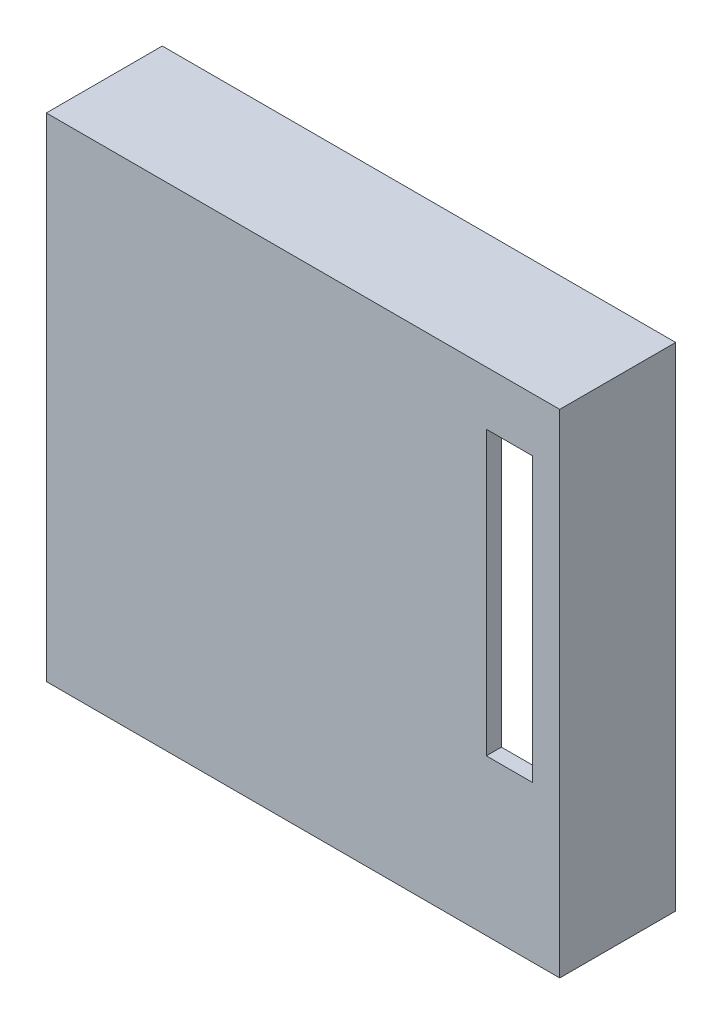
ISO-10303-21;
HEADER;
FILE_DESCRIPTION(('STEP AP214'),'2;1');
FILE_NAME('part.step','',(''),(''),'','','');
FILE_SCHEMA(('AUTOMOTIVE_DESIGN { 1 0 10303 214 1 1 1 1 }'));
ENDSEC;
DATA;
#1=APPLICATION_CONTEXT('core data for automotive mechanical design processes');
#2=APPLICATION_PROTOCOL_DEFINITION('international standard','automotive_design',2000,#1);
#3=PRODUCT_CONTEXT('',#1,'mechanical');
#4=PRODUCT('Part','Part','',(#3));
#5=PRODUCT_RELATED_PRODUCT_CATEGORY('part','',(#4));
#6=PRODUCT_DEFINITION_FORMATION('','',#4);
#7=PRODUCT_DEFINITION_CONTEXT('part definition',#1,'design');
#8=PRODUCT_DEFINITION('design','',#6,#7);
#9=PRODUCT_DEFINITION_SHAPE('','',#8);
#10=(LENGTH_UNIT() NAMED_UNIT(*) SI_UNIT(.MILLI.,.METRE.));
#11=(NAMED_UNIT(*) PLANE_ANGLE_UNIT() SI_UNIT($,.RADIAN.));
#12=(NAMED_UNIT(*) SI_UNIT($,.STERADIAN.) SOLID_ANGLE_UNIT());
#13=UNCERTAINTY_MEASURE_WITH_UNIT(LENGTH_MEASURE(1.E-05),#10,'distance_accuracy_value','');
#14=(GEOMETRIC_REPRESENTATION_CONTEXT(3) GLOBAL_UNCERTAINTY_ASSIGNED_CONTEXT((#13)) GLOBAL_UNIT_ASSIGNED_CONTEXT((#10,
#11,#12)) REPRESENTATION_CONTEXT('',''));
#15=CARTESIAN_POINT('',(0.,0.,0.));
#16=DIRECTION('',(0.,0.,1.));
#17=DIRECTION('',(1.,0.,0.));
#18=AXIS2_PLACEMENT_3D('',#15,#16,#17);
#19=CARTESIAN_POINT('',(-10.086587153814,1.18892620686154,79.8902578322619));
#20=DIRECTION('',(-0.999999999999996,8.4993707E-08,0.));
#21=DIRECTION('',(-8.4993707E-08,-0.999999999999996,0.));
#22=AXIS2_PLACEMENT_3D('',#19,#20,#21);
#23=PLANE('',#22);
#24=DIRECTION('',(0.,0.,1.));
#25=VECTOR('',#24,1.);
#26=CARTESIAN_POINT('',(-10.0865802523247,82.3889300215586,79.8902578322619));
#27=LINE('',#26,#25);
#28=CARTESIAN_POINT('',(-10.0865830741161,82.3889300215588,78.3902582614153));
#29=VERTEX_POINT('',#28);
#30=CARTESIAN_POINT('',(-10.0865802523247,82.3889300215586,79.8902578322619));
#31=VERTEX_POINT('',#30);
#32=EDGE_CURVE('E284',#29,#31,#27,.T.);
#33=ORIENTED_EDGE('',*,*,#32,.F.);
#34=DIRECTION('',(8.4993707E-08,0.999999999999996,0.));
#35=VECTOR('',#34,1.);
#36=CARTESIAN_POINT('',(-10.086587153814,1.18892620686154,78.3902582614153));
#37=LINE('',#36,#35);
#38=CARTESIAN_POINT('',(-10.0865789944182,97.1889262068612,78.3902582614153));
#39=VERTEX_POINT('',#38);
#40=EDGE_CURVE('E378',#29,#39,#37,.T.);
#41=ORIENTED_EDGE('',*,*,#40,.T.);
#42=DIRECTION('',(0.,0.,1.));
#43=VECTOR('',#42,1.);
#44=CARTESIAN_POINT('',(-10.0865789944182,97.1889262068612,79.8902578322619));
#45=LINE('',#44,#43);
#46=CARTESIAN_POINT('',(-10.0865789944182,97.1889262068612,79.8902578322619));
#47=VERTEX_POINT('',#46);
#48=EDGE_CURVE('E310',#39,#47,#45,.T.);
#49=ORIENTED_EDGE('',*,*,#48,.T.);
#50=DIRECTION('',(8.4993707E-08,0.999999999999996,0.));
#51=VECTOR('',#50,1.);
#52=CARTESIAN_POINT('',(-10.086587153814,1.18892620686154,79.8902578322619));
#53=LINE('',#52,#51);
#54=EDGE_CURVE('E425',#31,#47,#53,.T.);
#55=ORIENTED_EDGE('',*,*,#54,.F.);
#56=EDGE_LOOP('',(#33,#41,#49,#55));
#57=FACE_BOUND('',#56,.T.);
#58=ADVANCED_FACE('F35',(#57),#23,.F.);
#59=CARTESIAN_POINT('',(-12.094663160312,1.18892637753536,79.8902578322619));
#60=DIRECTION('',(0.,0.,-1.));
#61=DIRECTION('',(-1.,0.,0.));
#62=AXIS2_PLACEMENT_3D('',#59,#60,#61);
#63=PLANE('',#62);
#64=DIRECTION('',(-0.999999999999997,8.49937070000001E-08,0.));
#65=VECTOR('',#64,1.);
#66=CARTESIAN_POINT('',(-12.0946562588227,82.3889301922324,79.8902578322619));
#67=LINE('',#66,#65);
#68=CARTESIAN_POINT('',(-12.094663160312,82.3889301922329,79.8902578322619));
#69=VERTEX_POINT('',#68);
#70=EDGE_CURVE('E286',#31,#69,#67,.T.);
#71=ORIENTED_EDGE('',*,*,#70,.F.);
#72=ORIENTED_EDGE('',*,*,#54,.T.);
#73=DIRECTION('',(-0.999999999999996,8.49937069344234E-08,0.));
#74=VECTOR('',#73,1.);
#75=CARTESIAN_POINT('',(-12.0946550009162,97.1889263775351,79.8902578322619));
#76=LINE('',#75,#74);
#77=CARTESIAN_POINT('',(-12.0946550009162,97.1889263775351,79.8902578322619));
#78=VERTEX_POINT('',#77);
#79=EDGE_CURVE('E315',#47,#78,#76,.T.);
#80=ORIENTED_EDGE('',*,*,#79,.T.);
#81=DIRECTION('',(8.4993707E-08,0.999999999999996,0.));
#82=VECTOR('',#81,1.);
#83=CARTESIAN_POINT('',(-12.094663160312,1.18892637753536,79.8902578322619));
#84=LINE('',#83,#82);
#85=EDGE_CURVE('E421',#69,#78,#84,.T.);
#86=ORIENTED_EDGE('',*,*,#85,.F.);
#87=EDGE_LOOP('',(#71,#72,#80,#86));
#88=FACE_BOUND('',#87,.T.);
#89=ADVANCED_FACE('F467',(#88),#63,.F.);
#90=CARTESIAN_POINT('',(-12.094663160312,1.18892637753536,81.6902581898898));
#91=DIRECTION('',(-0.999999999999996,8.4993707E-08,0.));
#92=DIRECTION('',(-8.4993707E-08,-0.999999999999996,0.));
#93=AXIS2_PLACEMENT_3D('',#90,#91,#92);
#94=PLANE('',#93);
#95=DIRECTION('',(0.,0.,1.));
#96=VECTOR('',#95,1.);
#97=CARTESIAN_POINT('',(-12.0946562588227,82.3889301922324,81.6902581898898));
#98=LINE('',#97,#96);
#99=CARTESIAN_POINT('',(-12.0946562588227,82.3889301922324,81.6902581898898));
#100=VERTEX_POINT('',#99);
#101=EDGE_CURVE('E288',#69,#100,#98,.T.);
#102=ORIENTED_EDGE('',*,*,#101,.F.);
#103=ORIENTED_EDGE('',*,*,#85,.T.);
#104=DIRECTION('',(0.,0.,1.));
#105=VECTOR('',#104,1.);
#106=CARTESIAN_POINT('',(-12.0946550009162,97.1889263775351,81.6902581898898));
#107=LINE('',#106,#105);
#108=CARTESIAN_POINT('',(-12.0946550009162,97.1889263775351,81.6902581898898));
#109=VERTEX_POINT('',#108);
#110=EDGE_CURVE('E318',#78,#109,#107,.T.);
#111=ORIENTED_EDGE('',*,*,#110,.T.);
#112=DIRECTION('',(8.4993707E-08,0.999999999999996,0.));
#113=VECTOR('',#112,1.);
#114=CARTESIAN_POINT('',(-12.094663160312,1.18892637753536,81.6902581898898));
#115=LINE('',#114,#113);
#116=EDGE_CURVE('E417',#100,#109,#115,.T.);
#117=ORIENTED_EDGE('',*,*,#116,.F.);
#118=EDGE_LOOP('',(#102,#103,#111,#117));
#119=FACE_BOUND('',#118,.T.);
#120=ADVANCED_FACE('F473',(#119),#94,.F.);
#121=CARTESIAN_POINT('',(-9.92073479785703,1.18892619276513,81.6902581898898));
#122=DIRECTION('',(0.,0.,1.));
#123=DIRECTION('',(1.,0.,0.));
#124=AXIS2_PLACEMENT_3D('',#121,#122,#123);
#125=PLANE('',#124);
#126=DIRECTION('',(0.999999999999997,-8.49937070000001E-08,0.));
#127=VECTOR('',#126,1.);
#128=CARTESIAN_POINT('',(-9.92072789636769,82.3889300074621,81.6902581898898));
#129=LINE('',#128,#127);
#130=CARTESIAN_POINT('',(-9.92072663846116,82.388930007462,81.6902581898898));
#131=VERTEX_POINT('',#130);
#132=EDGE_CURVE('E290',#100,#131,#129,.T.);
#133=ORIENTED_EDGE('',*,*,#132,.F.);
#134=ORIENTED_EDGE('',*,*,#116,.T.);
#135=DIRECTION('',(0.999999999999996,-8.49937068411735E-08,0.));
#136=VECTOR('',#135,1.);
#137=CARTESIAN_POINT('',(-9.92072663846116,97.1889261927648,81.6902581898898));
#138=LINE('',#137,#136);
#139=CARTESIAN_POINT('',(-9.92072663846116,97.1889261927648,81.6902581898898));
#140=VERTEX_POINT('',#139);
#141=EDGE_CURVE('E321',#109,#140,#138,.T.);
#142=ORIENTED_EDGE('',*,*,#141,.T.);
#143=DIRECTION('',(8.4993707E-08,0.999999999999996,0.));
#144=VECTOR('',#143,1.);
#145=CARTESIAN_POINT('',(-9.92073479785703,1.18892619276513,81.6902581898898));
#146=LINE('',#145,#144);
#147=EDGE_CURVE('E413',#131,#140,#146,.T.);
#148=ORIENTED_EDGE('',*,*,#147,.F.);
#149=EDGE_LOOP('',(#133,#134,#142,#148));
#150=FACE_BOUND('',#149,.T.);
#151=ADVANCED_FACE('F504',(#150),#125,.F.);
#152=CARTESIAN_POINT('',(-9.92073479785703,1.18892619276513,98.4632960729149));
#153=DIRECTION('',(-0.999999999999996,8.4993707E-08,0.));
#154=DIRECTION('',(-8.4993707E-08,-0.999999999999996,0.));
#155=AXIS2_PLACEMENT_3D('',#152,#153,#154);
#156=PLANE('',#155);
#157=DIRECTION('',(0.,0.,1.));
#158=VECTOR('',#157,1.);
#159=CARTESIAN_POINT('',(-9.9207278963677,82.3889300074621,98.4632960729149));
#160=LINE('',#159,#158);
#161=CARTESIAN_POINT('',(-9.92073090939477,82.3889300074624,82.3135003156992));
#162=VERTEX_POINT('',#161);
#163=EDGE_CURVE('E292',#131,#162,#160,.T.);
#164=ORIENTED_EDGE('',*,*,#163,.F.);
#165=ORIENTED_EDGE('',*,*,#147,.T.);
#166=DIRECTION('',(0.,0.,1.));
#167=VECTOR('',#166,1.);
#168=CARTESIAN_POINT('',(-9.92072663846116,97.1889261927648,98.4632960729149));
#169=LINE('',#168,#167);
#170=CARTESIAN_POINT('',(-9.92072663846116,97.1889261927648,98.4632960729149));
#171=VERTEX_POINT('',#170);
#172=EDGE_CURVE('E324',#140,#171,#169,.T.);
#173=ORIENTED_EDGE('',*,*,#172,.T.);
#174=DIRECTION('',(8.4993707E-08,0.999999999999996,0.));
#175=VECTOR('',#174,1.);
#176=CARTESIAN_POINT('',(-9.92073479785703,1.18892619276513,98.4632960729149));
#177=LINE('',#176,#175);
#178=CARTESIAN_POINT('',(-9.92073479785703,1.18892619276513,98.4632960729149));
#179=VERTEX_POINT('',#178);
#180=EDGE_CURVE('E410',#179,#171,#177,.T.);
#181=ORIENTED_EDGE('',*,*,#180,.F.);
#182=DIRECTION('',(0.,0.,1.));
#183=VECTOR('',#182,1.);
#184=CARTESIAN_POINT('',(-9.92073479785703,1.18892619276513,98.4632960729149));
#185=LINE('',#184,#183);
#186=CARTESIAN_POINT('',(-9.92073479785703,1.18892619276513,81.6902581898898));
#187=VERTEX_POINT('',#186);
#188=EDGE_CURVE('E354',#187,#179,#185,.T.);
#189=ORIENTED_EDGE('',*,*,#188,.F.);
#190=CARTESIAN_POINT('',(-9.92072663846116,11.4889261927645,81.6902581898898));
#191=VERTEX_POINT('',#190);
#192=EDGE_CURVE('E414',#187,#191,#146,.T.);
#193=ORIENTED_EDGE('',*,*,#192,.T.);
#194=DIRECTION('',(0.,0.,1.));
#195=VECTOR('',#194,1.);
#196=CARTESIAN_POINT('',(-9.92073392242185,11.4889261927651,98.4632960729149));
#197=LINE('',#196,#195);
#198=CARTESIAN_POINT('',(-9.92073392242184,11.4889261927651,82.3135003156992));
#199=VERTEX_POINT('',#198);
#200=EDGE_CURVE('E281',#191,#199,#197,.T.);
#201=ORIENTED_EDGE('',*,*,#200,.T.);
#202=DIRECTION('',(8.4993707E-08,0.999999999999996,0.));
#203=VECTOR('',#202,1.);
#204=CARTESIAN_POINT('',(-9.92073479785703,1.18892619276513,82.3135003156992));
#205=LINE('',#204,#203);
#206=EDGE_CURVE('E294',#199,#162,#205,.T.);
#207=ORIENTED_EDGE('',*,*,#206,.T.);
#208=EDGE_LOOP('',(#164,#165,#173,#181,#189,#193,#201,#207));
#209=FACE_BOUND('',#208,.T.);
#210=ADVANCED_FACE('F453',(#209),#156,.F.);
#211=CARTESIAN_POINT('',(-12.920734797857,1.18892644774625,78.3902582614153));
#212=DIRECTION('',(0.999999999999996,-8.4993707E-08,0.));
#213=DIRECTION('',(8.4993707E-08,0.999999999999996,0.));
#214=AXIS2_PLACEMENT_3D('',#211,#212,#213);
#215=PLANE('',#214);
#216=DIRECTION('',(0.,0.,1.));
#217=VECTOR('',#216,1.);
#218=CARTESIAN_POINT('',(-12.9207278963677,82.3889302624433,78.3902582614153));
#219=LINE('',#218,#217);
#220=CARTESIAN_POINT('',(-12.9207278963677,82.3889302624433,78.3902582614153));
#221=VERTEX_POINT('',#220);
#222=CARTESIAN_POINT('',(-12.9207278963677,82.3889302624433,82.3135003156992));
#223=VERTEX_POINT('',#222);
#224=EDGE_CURVE('E262',#221,#223,#219,.T.);
#225=ORIENTED_EDGE('',*,*,#224,.T.);
#226=DIRECTION('',(8.49937069991935E-08,0.999999999999996,0.));
#227=VECTOR('',#226,1.);
#228=CARTESIAN_POINT('',(-12.9207339224218,11.4889264477462,82.3135003156992));
#229=LINE('',#228,#227);
#230=CARTESIAN_POINT('',(-12.9207339224218,11.4889264477462,82.3135003156992));
#231=VERTEX_POINT('',#230);
#232=EDGE_CURVE('E259',#231,#223,#229,.T.);
#233=ORIENTED_EDGE('',*,*,#232,.F.);
#234=DIRECTION('',(0.,0.,1.));
#235=VECTOR('',#234,1.);
#236=CARTESIAN_POINT('',(-12.9207339224218,11.4889264477462,78.3902582614153));
#237=LINE('',#236,#235);
#238=CARTESIAN_POINT('',(-12.9207339224218,11.4889264477462,78.3902582614153));
#239=VERTEX_POINT('',#238);
#240=EDGE_CURVE('E256',#239,#231,#237,.T.);
#241=ORIENTED_EDGE('',*,*,#240,.F.);
#242=DIRECTION('',(8.4993707E-08,0.999999999999996,0.));
#243=VECTOR('',#242,1.);
#244=CARTESIAN_POINT('',(-12.920734797857,1.18892644774625,78.3902582614153));
#245=LINE('',#244,#243);
#246=CARTESIAN_POINT('',(-12.920734797857,1.18892644774625,78.3902582614153));
#247=VERTEX_POINT('',#246);
#248=EDGE_CURVE('E383',#247,#239,#245,.T.);
#249=ORIENTED_EDGE('',*,*,#248,.F.);
#250=DIRECTION('',(0.,0.,-1.));
#251=VECTOR('',#250,1.);
#252=CARTESIAN_POINT('',(-12.920734797857,1.18892644774625,78.3902582614153));
#253=LINE('',#252,#251);
#254=CARTESIAN_POINT('',(-12.920734797857,1.18892644774625,101.463296072915));
#255=VERTEX_POINT('',#254);
#256=EDGE_CURVE('E374',#255,#247,#253,.T.);
#257=ORIENTED_EDGE('',*,*,#256,.F.);
#258=DIRECTION('',(8.4993707E-08,0.999999999999996,0.));
#259=VECTOR('',#258,1.);
#260=CARTESIAN_POINT('',(-12.920734797857,1.18892644774625,101.463296072915));
#261=LINE('',#260,#259);
#262=CARTESIAN_POINT('',(-12.9207264684737,99.1889264477459,101.463296072915));
#263=VERTEX_POINT('',#262);
#264=EDGE_CURVE('E386',#255,#263,#261,.T.);
#265=ORIENTED_EDGE('',*,*,#264,.T.);
#266=DIRECTION('',(0.,0.,1.));
#267=VECTOR('',#266,1.);
#268=CARTESIAN_POINT('',(-12.9207264684737,99.1889264477459,101.463296072915));
#269=LINE('',#268,#267);
#270=CARTESIAN_POINT('',(-12.9207264684737,99.1889264477459,78.3902582614153));
#271=VERTEX_POINT('',#270);
#272=EDGE_CURVE('E304',#271,#263,#269,.T.);
#273=ORIENTED_EDGE('',*,*,#272,.F.);
#274=EDGE_CURVE('E382',#221,#271,#245,.T.);
#275=ORIENTED_EDGE('',*,*,#274,.F.);
#276=EDGE_LOOP('',(#225,#233,#241,#249,#257,#265,#273,#275));
#277=FACE_BOUND('',#276,.T.);
#278=ADVANCED_FACE('F446',(#277),#215,.F.);
#279=CARTESIAN_POINT('',(-10.086587153814,1.18892620686154,78.3902582614153));
#280=DIRECTION('',(0.,0.,1.));
#281=DIRECTION('',(1.,0.,0.));
#282=AXIS2_PLACEMENT_3D('',#279,#280,#281);
#283=PLANE('',#282);
#284=DIRECTION('',(0.999999999999997,-8.49937070000001E-08,0.));
#285=VECTOR('',#284,1.);
#286=CARTESIAN_POINT('',(-10.0865802523247,82.3889300215586,78.3902582614153));
#287=LINE('',#286,#285);
#288=EDGE_CURVE('E11',#221,#29,#287,.T.);
#289=ORIENTED_EDGE('',*,*,#288,.F.);
#290=ORIENTED_EDGE('',*,*,#274,.T.);
#291=DIRECTION('',(-0.999999999999996,8.49937069937892E-08,0.));
#292=VECTOR('',#291,1.);
#293=CARTESIAN_POINT('',(89.2475702501234,99.1889177640837,78.3902582614153));
#294=LINE('',#293,#292);
#295=CARTESIAN_POINT('',(89.2475702501234,99.1889177640837,78.3902582614153));
#296=VERTEX_POINT('',#295);
#297=EDGE_CURVE('E301',#296,#271,#294,.T.);
#298=ORIENTED_EDGE('',*,*,#297,.F.);
#299=DIRECTION('',(8.4993707E-08,0.999999999999996,0.));
#300=VECTOR('',#299,1.);
#301=CARTESIAN_POINT('',(89.2475619207401,1.18891776408397,78.3902582614153));
#302=LINE('',#301,#300);
#303=CARTESIAN_POINT('',(89.2475619207401,1.18891776408397,78.3902582614153));
#304=VERTEX_POINT('',#303);
#305=EDGE_CURVE('E390',#304,#296,#302,.T.);
#306=ORIENTED_EDGE('',*,*,#305,.F.);
#307=DIRECTION('',(0.999999999999996,-8.49937070234416E-08,0.));
#308=VECTOR('',#307,1.);
#309=CARTESIAN_POINT('',(89.2475619207401,1.18891776408397,78.3902582614153));
#310=LINE('',#309,#308);
#311=CARTESIAN_POINT('',(86.4134142766971,1.18891800496869,78.3902582614153));
#312=VERTEX_POINT('',#311);
#313=EDGE_CURVE('E368',#312,#304,#310,.T.);
#314=ORIENTED_EDGE('',*,*,#313,.F.);
#315=DIRECTION('',(8.4993707E-08,0.999999999999996,0.));
#316=VECTOR('',#315,1.);
#317=CARTESIAN_POINT('',(86.4134142766971,1.18891800496869,78.3902582614153));
#318=LINE('',#317,#316);
#319=CARTESIAN_POINT('',(86.413422436093,97.1889180049684,78.3902582614153));
#320=VERTEX_POINT('',#319);
#321=EDGE_CURVE('E392',#312,#320,#318,.T.);
#322=ORIENTED_EDGE('',*,*,#321,.T.);
#323=DIRECTION('',(-0.999999999999996,8.49937069937892E-08,0.));
#324=VECTOR('',#323,1.);
#325=CARTESIAN_POINT('',(89.247570080136,97.1889177640837,78.3902582614153));
#326=LINE('',#325,#324);
#327=EDGE_CURVE('E297',#320,#39,#326,.T.);
#328=ORIENTED_EDGE('',*,*,#327,.T.);
#329=ORIENTED_EDGE('',*,*,#40,.F.);
#330=EDGE_LOOP('',(#289,#290,#298,#306,#314,#322,#328,#329));
#331=FACE_BOUND('',#330,.T.);
#332=ADVANCED_FACE('F474',(#331),#283,.F.);
#333=CARTESIAN_POINT('',(-10.086587153814,1.18892620686154,78.3902582614153));
#334=VERTEX_POINT('',#333);
#335=CARTESIAN_POINT('',(-10.0865862783788,11.4889261502685,78.3902582614153));
#336=VERTEX_POINT('',#335);
#337=EDGE_CURVE('E379',#334,#336,#37,.T.);
#338=ORIENTED_EDGE('',*,*,#337,.T.);
#339=DIRECTION('',(0.,0.,1.));
#340=VECTOR('',#339,1.);
#341=CARTESIAN_POINT('',(-10.0865862783788,11.4889262068615,79.8902578322619));
#342=LINE('',#341,#340);
#343=CARTESIAN_POINT('',(-10.0865862783788,11.4889262068615,79.8902578322619));
#344=VERTEX_POINT('',#343);
#345=EDGE_CURVE('E268',#336,#344,#342,.T.);
#346=ORIENTED_EDGE('',*,*,#345,.T.);
#347=CARTESIAN_POINT('',(-10.086587153814,1.18892620686154,79.8902578322619));
#348=VERTEX_POINT('',#347);
#349=EDGE_CURVE('E426',#348,#344,#53,.T.);
#350=ORIENTED_EDGE('',*,*,#349,.F.);
#351=DIRECTION('',(0.,0.,1.));
#352=VECTOR('',#351,1.);
#353=CARTESIAN_POINT('',(-10.086587153814,1.18892620686154,79.8902578322619));
#354=LINE('',#353,#352);
#355=EDGE_CURVE('E345',#334,#348,#354,.T.);
#356=ORIENTED_EDGE('',*,*,#355,.F.);
#357=EDGE_LOOP('',(#338,#346,#350,#356));
#358=FACE_BOUND('',#357,.T.);
#359=ADVANCED_FACE('F37',(#358),#23,.F.);
#360=ORIENTED_EDGE('',*,*,#349,.T.);
#361=DIRECTION('',(-0.999999999999997,8.49937070000001E-08,0.));
#362=VECTOR('',#361,1.);
#363=CARTESIAN_POINT('',(-12.0946622848768,11.4889263775353,79.8902578322619));
#364=LINE('',#363,#362);
#365=CARTESIAN_POINT('',(-12.094663160312,11.4889263775354,79.8902578322619));
#366=VERTEX_POINT('',#365);
#367=EDGE_CURVE('E272',#344,#366,#364,.T.);
#368=ORIENTED_EDGE('',*,*,#367,.T.);
#369=CARTESIAN_POINT('',(-12.094663160312,1.18892637753536,79.8902578322619));
#370=VERTEX_POINT('',#369);
#371=EDGE_CURVE('E422',#370,#366,#84,.T.);
#372=ORIENTED_EDGE('',*,*,#371,.F.);
#373=DIRECTION('',(-0.999999999999996,8.49937069344234E-08,0.));
#374=VECTOR('',#373,1.);
#375=CARTESIAN_POINT('',(-12.094663160312,1.18892637753536,79.8902578322619));
#376=LINE('',#375,#374);
#377=EDGE_CURVE('E348',#348,#370,#376,.T.);
#378=ORIENTED_EDGE('',*,*,#377,.F.);
#379=EDGE_LOOP('',(#360,#368,#372,#378));
#380=FACE_BOUND('',#379,.T.);
#381=ADVANCED_FACE('F465',(#380),#63,.F.);
#382=ORIENTED_EDGE('',*,*,#371,.T.);
#383=DIRECTION('',(0.,0.,1.));
#384=VECTOR('',#383,1.);
#385=CARTESIAN_POINT('',(-12.0946622848768,11.4889263775353,81.6902581898898));
#386=LINE('',#385,#384);
#387=CARTESIAN_POINT('',(-12.0946622848768,11.4889263775353,81.6902581898898));
#388=VERTEX_POINT('',#387);
#389=EDGE_CURVE('E275',#366,#388,#386,.T.);
#390=ORIENTED_EDGE('',*,*,#389,.T.);
#391=CARTESIAN_POINT('',(-12.094663160312,1.18892637753536,81.6902581898898));
#392=VERTEX_POINT('',#391);
#393=EDGE_CURVE('E418',#392,#388,#115,.T.);
#394=ORIENTED_EDGE('',*,*,#393,.F.);
#395=DIRECTION('',(0.,0.,1.));
#396=VECTOR('',#395,1.);
#397=CARTESIAN_POINT('',(-12.094663160312,1.18892637753536,81.6902581898898));
#398=LINE('',#397,#396);
#399=EDGE_CURVE('E350',#370,#392,#398,.T.);
#400=ORIENTED_EDGE('',*,*,#399,.F.);
#401=EDGE_LOOP('',(#382,#390,#394,#400));
#402=FACE_BOUND('',#401,.T.);
#403=ADVANCED_FACE('F462',(#402),#94,.F.);
#404=ORIENTED_EDGE('',*,*,#393,.T.);
#405=DIRECTION('',(0.999999999999997,-8.49937070000001E-08,0.));
#406=VECTOR('',#405,1.);
#407=CARTESIAN_POINT('',(-9.92073392242184,11.4889261927651,81.6902581898898));
#408=LINE('',#407,#406);
#409=EDGE_CURVE('E278',#388,#191,#408,.T.);
#410=ORIENTED_EDGE('',*,*,#409,.T.);
#411=ORIENTED_EDGE('',*,*,#192,.F.);
#412=DIRECTION('',(0.999999999999996,-8.49937068411735E-08,0.));
#413=VECTOR('',#412,1.);
#414=CARTESIAN_POINT('',(-9.92073479785703,1.18892619276513,81.6902581898898));
#415=LINE('',#414,#413);
#416=EDGE_CURVE('E352',#392,#187,#415,.T.);
#417=ORIENTED_EDGE('',*,*,#416,.F.);
#418=EDGE_LOOP('',(#404,#410,#411,#417));
#419=FACE_BOUND('',#418,.T.);
#420=ADVANCED_FACE('F459',(#419),#125,.F.);
#421=CARTESIAN_POINT('',(86.2475619207401,1.1889180190651,98.4632960729149));
#422=DIRECTION('',(0.,0.,1.));
#423=DIRECTION('',(1.,0.,0.));
#424=AXIS2_PLACEMENT_3D('',#421,#422,#423);
#425=PLANE('',#424);
#426=DIRECTION('',(-1.,0.,0.));
#427=VECTOR('',#426,1.);
#428=CARTESIAN_POINT('',(86.2475619207401,88.4630950396455,98.4632960729149));
#429=LINE('',#428,#427);
#430=CARTESIAN_POINT('',(83.7940113156543,88.4630950396455,98.4632960729149));
#431=VERTEX_POINT('',#430);
#432=CARTESIAN_POINT('',(74.6402207649819,88.4630950396455,98.4632960729149));
#433=VERTEX_POINT('',#432);
#434=EDGE_CURVE('E250',#431,#433,#429,.T.);
#435=ORIENTED_EDGE('',*,*,#434,.T.);
#436=DIRECTION('',(0.,-1.,0.));
#437=VECTOR('',#436,1.);
#438=CARTESIAN_POINT('',(74.6402207649819,1.1889180190651,98.4632960729149));
#439=LINE('',#438,#437);
#440=CARTESIAN_POINT('',(74.6402207649819,32.1746737356987,98.4632960729149));
#441=VERTEX_POINT('',#440);
#442=EDGE_CURVE('E253',#433,#441,#439,.T.);
#443=ORIENTED_EDGE('',*,*,#442,.T.);
#444=DIRECTION('',(1.,0.,0.));
#445=VECTOR('',#444,1.);
#446=CARTESIAN_POINT('',(86.2475619207401,32.1746737356987,98.4632960729149));
#447=LINE('',#446,#445);
#448=CARTESIAN_POINT('',(83.7940113156543,32.1746737356987,98.4632960729149));
#449=VERTEX_POINT('',#448);
#450=EDGE_CURVE('E245',#441,#449,#447,.T.);
#451=ORIENTED_EDGE('',*,*,#450,.T.);
#452=DIRECTION('',(0.,1.,0.));
#453=VECTOR('',#452,1.);
#454=CARTESIAN_POINT('',(83.7940113156543,1.1889180190651,98.4632960729149));
#455=LINE('',#454,#453);
#456=EDGE_CURVE('E225',#449,#431,#455,.T.);
#457=ORIENTED_EDGE('',*,*,#456,.T.);
#458=EDGE_LOOP('',(#435,#443,#451,#457));
#459=FACE_BOUND('',#458,.T.);
#460=ORIENTED_EDGE('',*,*,#180,.T.);
#461=DIRECTION('',(0.999999999999996,-8.49937070009718E-08,0.));
#462=VECTOR('',#461,1.);
#463=CARTESIAN_POINT('',(86.247570080136,97.1889180190648,98.4632960729149));
#464=LINE('',#463,#462);
#465=CARTESIAN_POINT('',(86.247570080136,97.1889180190648,98.4632960729149));
#466=VERTEX_POINT('',#465);
#467=EDGE_CURVE('E327',#171,#466,#464,.T.);
#468=ORIENTED_EDGE('',*,*,#467,.T.);
#469=DIRECTION('',(8.4993707E-08,0.999999999999996,0.));
#470=VECTOR('',#469,1.);
#471=CARTESIAN_POINT('',(86.2475619207401,1.1889180190651,98.4632960729149));
#472=LINE('',#471,#470);
#473=CARTESIAN_POINT('',(86.2475619207401,1.1889180190651,98.4632960729149));
#474=VERTEX_POINT('',#473);
#475=EDGE_CURVE('E407',#474,#466,#472,.T.);
#476=ORIENTED_EDGE('',*,*,#475,.F.);
#477=DIRECTION('',(0.999999999999996,-8.49937070009718E-08,0.));
#478=VECTOR('',#477,1.);
#479=CARTESIAN_POINT('',(86.2475619207401,1.1889180190651,98.4632960729149));
#480=LINE('',#479,#478);
#481=EDGE_CURVE('E356',#179,#474,#480,.T.);
#482=ORIENTED_EDGE('',*,*,#481,.F.);
#483=EDGE_LOOP('',(#460,#468,#476,#482));
#484=FACE_BOUND('',#483,.T.);
#485=ADVANCED_FACE('F542',(#459,#484),#425,.F.);
#486=CARTESIAN_POINT('',(86.2475619207401,1.1889180190651,81.6902581898897));
#487=DIRECTION('',(0.999999999999996,-8.4993707E-08,0.));
#488=DIRECTION('',(8.4993707E-08,0.999999999999996,0.));
#489=AXIS2_PLACEMENT_3D('',#486,#487,#488);
#490=PLANE('',#489);
#491=ORIENTED_EDGE('',*,*,#475,.T.);
#492=DIRECTION('',(0.,0.,-1.));
#493=VECTOR('',#492,1.);
#494=CARTESIAN_POINT('',(86.247570080136,97.1889180190648,81.6902581898897));
#495=LINE('',#494,#493);
#496=CARTESIAN_POINT('',(86.247570080136,97.1889180190648,81.6902581898897));
#497=VERTEX_POINT('',#496);
#498=EDGE_CURVE('E330',#466,#497,#495,.T.);
#499=ORIENTED_EDGE('',*,*,#498,.T.);
#500=DIRECTION('',(8.4993707E-08,0.999999999999996,0.));
#501=VECTOR('',#500,1.);
#502=CARTESIAN_POINT('',(86.2475619207401,1.1889180190651,81.6902581898897));
#503=LINE('',#502,#501);
#504=CARTESIAN_POINT('',(86.2475619207401,1.1889180190651,81.6902581898897));
#505=VERTEX_POINT('',#504);
#506=EDGE_CURVE('E404',#505,#497,#503,.T.);
#507=ORIENTED_EDGE('',*,*,#506,.F.);
#508=DIRECTION('',(0.,0.,-1.));
#509=VECTOR('',#508,1.);
#510=CARTESIAN_POINT('',(86.2475619207401,1.1889180190651,81.6902581898897));
#511=LINE('',#510,#509);
#512=EDGE_CURVE('E358',#474,#505,#511,.T.);
#513=ORIENTED_EDGE('',*,*,#512,.F.);
#514=EDGE_LOOP('',(#491,#499,#507,#513));
#515=FACE_BOUND('',#514,.T.);
#516=ADVANCED_FACE('F539',(#515),#490,.F.);
#517=CARTESIAN_POINT('',(88.4214902831951,1.18891783429487,81.6902581898897));
#518=DIRECTION('',(0.,0.,1.));
#519=DIRECTION('',(1.,0.,0.));
#520=AXIS2_PLACEMENT_3D('',#517,#518,#519);
#521=PLANE('',#520);
#522=ORIENTED_EDGE('',*,*,#506,.T.);
#523=DIRECTION('',(0.999999999999996,-8.49937070406656E-08,0.));
#524=VECTOR('',#523,1.);
#525=CARTESIAN_POINT('',(88.4214984425909,97.1889178342946,81.6902581898897));
#526=LINE('',#525,#524);
#527=CARTESIAN_POINT('',(88.4214984425909,97.1889178342946,81.6902581898897));
#528=VERTEX_POINT('',#527);
#529=EDGE_CURVE('E333',#497,#528,#526,.T.);
#530=ORIENTED_EDGE('',*,*,#529,.T.);
#531=DIRECTION('',(8.4993707E-08,0.999999999999996,0.));
#532=VECTOR('',#531,1.);
#533=CARTESIAN_POINT('',(88.4214902831951,1.18891783429487,81.6902581898897));
#534=LINE('',#533,#532);
#535=CARTESIAN_POINT('',(88.4214902831951,1.18891783429487,81.6902581898897));
#536=VERTEX_POINT('',#535);
#537=EDGE_CURVE('E401',#536,#528,#534,.T.);
#538=ORIENTED_EDGE('',*,*,#537,.F.);
#539=DIRECTION('',(0.999999999999996,-8.49937070406656E-08,0.));
#540=VECTOR('',#539,1.);
#541=CARTESIAN_POINT('',(88.4214902831951,1.18891783429487,81.6902581898897));
#542=LINE('',#541,#540);
#543=EDGE_CURVE('E360',#505,#536,#542,.T.);
#544=ORIENTED_EDGE('',*,*,#543,.F.);
#545=EDGE_LOOP('',(#522,#530,#538,#544));
#546=FACE_BOUND('',#545,.T.);
#547=ADVANCED_FACE('F535',(#546),#521,.F.);
#548=CARTESIAN_POINT('',(88.4214902831951,1.18891783429487,79.8902578322618));
#549=DIRECTION('',(0.999999999999996,-8.4993707E-08,0.));
#550=DIRECTION('',(8.4993707E-08,0.999999999999996,0.));
#551=AXIS2_PLACEMENT_3D('',#548,#549,#550);
#552=PLANE('',#551);
#553=ORIENTED_EDGE('',*,*,#537,.T.);
#554=DIRECTION('',(0.,0.,-1.));
#555=VECTOR('',#554,1.);
#556=CARTESIAN_POINT('',(88.4214984425909,97.1889178342946,79.8902578322618));
#557=LINE('',#556,#555);
#558=CARTESIAN_POINT('',(88.4214984425909,97.1889178342946,79.8902578322618));
#559=VERTEX_POINT('',#558);
#560=EDGE_CURVE('E336',#528,#559,#557,.T.);
#561=ORIENTED_EDGE('',*,*,#560,.T.);
#562=DIRECTION('',(8.4993707E-08,0.999999999999996,0.));
#563=VECTOR('',#562,1.);
#564=CARTESIAN_POINT('',(88.4214902831951,1.18891783429487,79.8902578322618));
#565=LINE('',#564,#563);
#566=CARTESIAN_POINT('',(88.4214902831951,1.18891783429487,79.8902578322618));
#567=VERTEX_POINT('',#566);
#568=EDGE_CURVE('E398',#567,#559,#565,.T.);
#569=ORIENTED_EDGE('',*,*,#568,.F.);
#570=DIRECTION('',(0.,0.,-1.));
#571=VECTOR('',#570,1.);
#572=CARTESIAN_POINT('',(88.4214902831951,1.18891783429487,79.8902578322618));
#573=LINE('',#572,#571);
#574=EDGE_CURVE('E362',#536,#567,#573,.T.);
#575=ORIENTED_EDGE('',*,*,#574,.F.);
#576=EDGE_LOOP('',(#553,#561,#569,#575));
#577=FACE_BOUND('',#576,.T.);
#578=ADVANCED_FACE('F532',(#577),#552,.F.);
#579=CARTESIAN_POINT('',(86.4134142766971,1.18891800496869,79.8902578322618));
#580=DIRECTION('',(0.,0.,-1.));
#581=DIRECTION('',(-1.,0.,0.));
#582=AXIS2_PLACEMENT_3D('',#579,#580,#581);
#583=PLANE('',#582);
#584=ORIENTED_EDGE('',*,*,#568,.T.);
#585=DIRECTION('',(-0.999999999999996,8.4993706934424E-08,0.));
#586=VECTOR('',#585,1.);
#587=CARTESIAN_POINT('',(86.413422436093,97.1889180049684,79.8902578322618));
#588=LINE('',#587,#586);
#589=CARTESIAN_POINT('',(86.413422436093,97.1889180049684,79.8902578322618));
#590=VERTEX_POINT('',#589);
#591=EDGE_CURVE('E339',#559,#590,#588,.T.);
#592=ORIENTED_EDGE('',*,*,#591,.T.);
#593=DIRECTION('',(8.4993707E-08,0.999999999999996,0.));
#594=VECTOR('',#593,1.);
#595=CARTESIAN_POINT('',(86.4134142766971,1.18891800496869,79.8902578322618));
#596=LINE('',#595,#594);
#597=CARTESIAN_POINT('',(86.4134142766971,1.18891800496869,79.8902578322618));
#598=VERTEX_POINT('',#597);
#599=EDGE_CURVE('E395',#598,#590,#596,.T.);
#600=ORIENTED_EDGE('',*,*,#599,.F.);
#601=DIRECTION('',(-0.999999999999996,8.4993706934424E-08,0.));
#602=VECTOR('',#601,1.);
#603=CARTESIAN_POINT('',(86.4134142766971,1.18891800496869,79.8902578322618));
#604=LINE('',#603,#602);
#605=EDGE_CURVE('E364',#567,#598,#604,.T.);
#606=ORIENTED_EDGE('',*,*,#605,.F.);
#607=EDGE_LOOP('',(#584,#592,#600,#606));
#608=FACE_BOUND('',#607,.T.);
#609=ADVANCED_FACE('F527',(#608),#583,.F.);
#610=CARTESIAN_POINT('',(86.4134142766971,1.18891800496869,78.3902582614153));
#611=DIRECTION('',(0.999999999999996,-8.4993707E-08,0.));
#612=DIRECTION('',(8.4993707E-08,0.999999999999996,0.));
#613=AXIS2_PLACEMENT_3D('',#610,#611,#612);
#614=PLANE('',#613);
#615=ORIENTED_EDGE('',*,*,#599,.T.);
#616=DIRECTION('',(0.,0.,-1.));
#617=VECTOR('',#616,1.);
#618=CARTESIAN_POINT('',(86.413422436093,97.1889180049684,78.3902582614153));
#619=LINE('',#618,#617);
#620=EDGE_CURVE('E342',#590,#320,#619,.T.);
#621=ORIENTED_EDGE('',*,*,#620,.T.);
#622=ORIENTED_EDGE('',*,*,#321,.F.);
#623=DIRECTION('',(0.,0.,-1.));
#624=VECTOR('',#623,1.);
#625=CARTESIAN_POINT('',(86.4134142766971,1.18891800496869,78.3902582614153));
#626=LINE('',#625,#624);
#627=EDGE_CURVE('E366',#598,#312,#626,.T.);
#628=ORIENTED_EDGE('',*,*,#627,.F.);
#629=EDGE_LOOP('',(#615,#621,#622,#628));
#630=FACE_BOUND('',#629,.T.);
#631=ADVANCED_FACE('F525',(#630),#614,.F.);
#632=CARTESIAN_POINT('',(89.2475619207401,1.18891776408397,101.463296072915));
#633=DIRECTION('',(-0.999999999999996,8.4993707E-08,0.));
#634=DIRECTION('',(-8.4993707E-08,-0.999999999999996,0.));
#635=AXIS2_PLACEMENT_3D('',#632,#633,#634);
#636=PLANE('',#635);
#637=ORIENTED_EDGE('',*,*,#305,.T.);
#638=DIRECTION('',(0.,0.,-1.));
#639=VECTOR('',#638,1.);
#640=CARTESIAN_POINT('',(89.2475702501234,99.1889177640837,101.463296072915));
#641=LINE('',#640,#639);
#642=CARTESIAN_POINT('',(89.2475702501234,99.1889177640837,101.463296072915));
#643=VERTEX_POINT('',#642);
#644=EDGE_CURVE('E298',#643,#296,#641,.T.);
#645=ORIENTED_EDGE('',*,*,#644,.F.);
#646=DIRECTION('',(8.4993707E-08,0.999999999999996,0.));
#647=VECTOR('',#646,1.);
#648=CARTESIAN_POINT('',(89.2475619207401,1.18891776408397,101.463296072915));
#649=LINE('',#648,#647);
#650=CARTESIAN_POINT('',(89.2475619207401,1.18891776408397,101.463296072915));
#651=VERTEX_POINT('',#650);
#652=EDGE_CURVE('E388',#651,#643,#649,.T.);
#653=ORIENTED_EDGE('',*,*,#652,.F.);
#654=DIRECTION('',(0.,0.,1.));
#655=VECTOR('',#654,1.);
#656=CARTESIAN_POINT('',(89.2475619207401,1.18891776408397,101.463296072915));
#657=LINE('',#656,#655);
#658=EDGE_CURVE('E370',#304,#651,#657,.T.);
#659=ORIENTED_EDGE('',*,*,#658,.F.);
#660=EDGE_LOOP('',(#637,#645,#653,#659));
#661=FACE_BOUND('',#660,.T.);
#662=ADVANCED_FACE('F519',(#661),#636,.F.);
#663=CARTESIAN_POINT('',(-12.920734797857,1.18892644774625,101.463296072915));
#664=DIRECTION('',(0.,0.,-1.));
#665=DIRECTION('',(-1.,0.,0.));
#666=AXIS2_PLACEMENT_3D('',#663,#664,#665);
#667=PLANE('',#666);
#668=DIRECTION('',(1.,0.,0.));
#669=VECTOR('',#668,1.);
#670=CARTESIAN_POINT('',(74.6402207649819,32.1746737356987,101.463296072915));
#671=LINE('',#670,#669);
#672=CARTESIAN_POINT('',(74.6402207649819,32.1746737356987,101.463296072915));
#673=VERTEX_POINT('',#672);
#674=CARTESIAN_POINT('',(83.7940113156543,32.1746737356987,101.463296072915));
#675=VERTEX_POINT('',#674);
#676=EDGE_CURVE('E231',#673,#675,#671,.T.);
#677=ORIENTED_EDGE('',*,*,#676,.F.);
#678=DIRECTION('',(0.,-1.,0.));
#679=VECTOR('',#678,1.);
#680=CARTESIAN_POINT('',(74.6402207649819,32.1746737356987,101.463296072915));
#681=LINE('',#680,#679);
#682=CARTESIAN_POINT('',(74.6402207649819,88.4630950396455,101.463296072915));
#683=VERTEX_POINT('',#682);
#684=EDGE_CURVE('E58',#683,#673,#681,.T.);
#685=ORIENTED_EDGE('',*,*,#684,.F.);
#686=DIRECTION('',(-1.,0.,0.));
#687=VECTOR('',#686,1.);
#688=CARTESIAN_POINT('',(74.6402207649819,88.4630950396455,101.463296072915));
#689=LINE('',#688,#687);
#690=CARTESIAN_POINT('',(83.7940113156543,88.4630950396455,101.463296072915));
#691=VERTEX_POINT('',#690);
#692=EDGE_CURVE('E238',#691,#683,#689,.T.);
#693=ORIENTED_EDGE('',*,*,#692,.F.);
#694=DIRECTION('',(0.,1.,0.));
#695=VECTOR('',#694,1.);
#696=CARTESIAN_POINT('',(83.7940113156543,32.1746737356987,101.463296072915));
#697=LINE('',#696,#695);
#698=EDGE_CURVE('E222',#675,#691,#697,.T.);
#699=ORIENTED_EDGE('',*,*,#698,.F.);
#700=EDGE_LOOP('',(#677,#685,#693,#699));
#701=FACE_BOUND('',#700,.T.);
#702=ORIENTED_EDGE('',*,*,#652,.T.);
#703=DIRECTION('',(0.999999999999996,-8.49937069937892E-08,0.));
#704=VECTOR('',#703,1.);
#705=CARTESIAN_POINT('',(89.2475702501234,99.1889177640837,101.463296072915));
#706=LINE('',#705,#704);
#707=EDGE_CURVE('E307',#263,#643,#706,.T.);
#708=ORIENTED_EDGE('',*,*,#707,.F.);
#709=ORIENTED_EDGE('',*,*,#264,.F.);
#710=DIRECTION('',(-0.999999999999996,8.49937070022788E-08,0.));
#711=VECTOR('',#710,1.);
#712=CARTESIAN_POINT('',(-12.920734797857,1.18892644774625,101.463296072915));
#713=LINE('',#712,#711);
#714=EDGE_CURVE('E372',#651,#255,#713,.T.);
#715=ORIENTED_EDGE('',*,*,#714,.F.);
#716=EDGE_LOOP('',(#702,#708,#709,#715));
#717=FACE_BOUND('',#716,.T.);
#718=ADVANCED_FACE('F235',(#701,#717),#667,.F.);
#719=ORIENTED_EDGE('',*,*,#248,.T.);
#720=DIRECTION('',(0.999999999999997,-8.49937070000001E-08,0.));
#721=VECTOR('',#720,1.);
#722=CARTESIAN_POINT('',(-10.0865862783788,11.4889262068615,78.3902582614153));
#723=LINE('',#722,#721);
#724=EDGE_CURVE('E43',#239,#336,#723,.T.);
#725=ORIENTED_EDGE('',*,*,#724,.T.);
#726=ORIENTED_EDGE('',*,*,#337,.F.);
#727=DIRECTION('',(0.999999999999996,-8.49937070234418E-08,0.));
#728=VECTOR('',#727,1.);
#729=CARTESIAN_POINT('',(-10.086587153814,1.18892620686154,78.3902582614153));
#730=LINE('',#729,#728);
#731=EDGE_CURVE('E376',#247,#334,#730,.T.);
#732=ORIENTED_EDGE('',*,*,#731,.F.);
#733=EDGE_LOOP('',(#719,#725,#726,#732));
#734=FACE_BOUND('',#733,.T.);
#735=ADVANCED_FACE('F431',(#734),#283,.F.);
#736=CARTESIAN_POINT('',(1.01051172857121E-07,1.18892534956509,0.));
#737=DIRECTION('',(8.49937070234418E-08,0.999999999999996,0.));
#738=DIRECTION('',(-0.999999999999996,8.49937070234418E-08,0.));
#739=AXIS2_PLACEMENT_3D('',#736,#737,#738);
#740=PLANE('',#739);
#741=ORIENTED_EDGE('',*,*,#355,.T.);
#742=ORIENTED_EDGE('',*,*,#377,.T.);
#743=ORIENTED_EDGE('',*,*,#399,.T.);
#744=ORIENTED_EDGE('',*,*,#416,.T.);
#745=ORIENTED_EDGE('',*,*,#188,.T.);
#746=ORIENTED_EDGE('',*,*,#481,.T.);
#747=ORIENTED_EDGE('',*,*,#512,.T.);
#748=ORIENTED_EDGE('',*,*,#543,.T.);
#749=ORIENTED_EDGE('',*,*,#574,.T.);
#750=ORIENTED_EDGE('',*,*,#605,.T.);
#751=ORIENTED_EDGE('',*,*,#627,.T.);
#752=ORIENTED_EDGE('',*,*,#313,.T.);
#753=ORIENTED_EDGE('',*,*,#658,.T.);
#754=ORIENTED_EDGE('',*,*,#714,.T.);
#755=ORIENTED_EDGE('',*,*,#256,.T.);
#756=ORIENTED_EDGE('',*,*,#731,.T.);
#757=EDGE_LOOP('',(#741,#742,#743,#744,#745,#746,#747,#748,#749,#750,#751,#752,#753,#754,#755,#756));
#758=FACE_BOUND('',#757,.T.);
#759=ADVANCED_FACE('F440',(#758),#740,.F.);
#760=CARTESIAN_POINT('',(8.43043445824908E-06,99.1889253495648,0.));
#761=DIRECTION('',(8.49937069937892E-08,0.999999999999997,0.));
#762=DIRECTION('',(-0.999999999999996,8.49937069937892E-08,0.));
#763=AXIS2_PLACEMENT_3D('',#760,#761,#762);
#764=PLANE('',#763);
#765=ORIENTED_EDGE('',*,*,#644,.T.);
#766=ORIENTED_EDGE('',*,*,#297,.T.);
#767=ORIENTED_EDGE('',*,*,#272,.T.);
#768=ORIENTED_EDGE('',*,*,#707,.T.);
#769=EDGE_LOOP('',(#765,#766,#767,#768));
#770=FACE_BOUND('',#769,.T.);
#771=ADVANCED_FACE('F514',(#770),#764,.T.);
#772=CARTESIAN_POINT('',(8.2604470442022E-06,97.1889253495648,0.));
#773=DIRECTION('',(8.49937069937892E-08,0.999999999999997,0.));
#774=DIRECTION('',(-0.999999999999996,8.49937069937892E-08,0.));
#775=AXIS2_PLACEMENT_3D('',#772,#773,#774);
#776=PLANE('',#775);
#777=ORIENTED_EDGE('',*,*,#48,.F.);
#778=ORIENTED_EDGE('',*,*,#327,.F.);
#779=ORIENTED_EDGE('',*,*,#620,.F.);
#780=ORIENTED_EDGE('',*,*,#591,.F.);
#781=ORIENTED_EDGE('',*,*,#560,.F.);
#782=ORIENTED_EDGE('',*,*,#529,.F.);
#783=ORIENTED_EDGE('',*,*,#498,.F.);
#784=ORIENTED_EDGE('',*,*,#467,.F.);
#785=ORIENTED_EDGE('',*,*,#172,.F.);
#786=ORIENTED_EDGE('',*,*,#141,.F.);
#787=ORIENTED_EDGE('',*,*,#110,.F.);
#788=ORIENTED_EDGE('',*,*,#79,.F.);
#789=EDGE_LOOP('',(#777,#778,#779,#780,#781,#782,#783,#784,#785,#786,#787,#788));
#790=FACE_BOUND('',#789,.T.);
#791=ADVANCED_FACE('F493',(#790),#776,.F.);
#792=CARTESIAN_POINT('',(-5.92073392242185,11.4889258527903,82.3135003156992));
#793=DIRECTION('',(0.,0.,1.));
#794=DIRECTION('',(1.,0.,0.));
#795=AXIS2_PLACEMENT_3D('',#792,#793,#794);
#796=PLANE('',#795);
#797=DIRECTION('',(-0.999999999999996,8.4993707E-08,0.));
#798=VECTOR('',#797,1.);
#799=CARTESIAN_POINT('',(-5.92073392242185,11.4889258527903,82.3135003156992));
#800=LINE('',#799,#798);
#801=EDGE_CURVE('E265',#199,#231,#800,.T.);
#802=ORIENTED_EDGE('',*,*,#801,.T.);
#803=ORIENTED_EDGE('',*,*,#232,.T.);
#804=DIRECTION('',(-0.999999999999996,8.4993707E-08,0.));
#805=VECTOR('',#804,1.);
#806=CARTESIAN_POINT('',(-5.9207278963677,82.3889296674873,82.3135003156992));
#807=LINE('',#806,#805);
#808=EDGE_CURVE('E266',#162,#223,#807,.T.);
#809=ORIENTED_EDGE('',*,*,#808,.F.);
#810=ORIENTED_EDGE('',*,*,#206,.F.);
#811=EDGE_LOOP('',(#802,#803,#809,#810));
#812=FACE_BOUND('',#811,.T.);
#813=ADVANCED_FACE('F509',(#812),#796,.F.);
#814=CARTESIAN_POINT('',(-5.9207278963677,82.3889296674873,78.3902582614153));
#815=DIRECTION('',(-8.4993707E-08,-0.999999999999996,0.));
#816=DIRECTION('',(0.999999999999997,-8.49937070000001E-08,0.));
#817=AXIS2_PLACEMENT_3D('',#814,#815,#816);
#818=PLANE('',#817);
#819=ORIENTED_EDGE('',*,*,#163,.T.);
#820=ORIENTED_EDGE('',*,*,#808,.T.);
#821=ORIENTED_EDGE('',*,*,#224,.F.);
#822=ORIENTED_EDGE('',*,*,#288,.T.);
#823=ORIENTED_EDGE('',*,*,#32,.T.);
#824=ORIENTED_EDGE('',*,*,#70,.T.);
#825=ORIENTED_EDGE('',*,*,#101,.T.);
#826=ORIENTED_EDGE('',*,*,#132,.T.);
#827=EDGE_LOOP('',(#819,#820,#821,#822,#823,#824,#825,#826));
#828=FACE_BOUND('',#827,.T.);
#829=ADVANCED_FACE('F499',(#828),#818,.T.);
#830=CARTESIAN_POINT('',(-5.92073392242185,11.4889258527903,78.3902582614153));
#831=DIRECTION('',(-8.4993707E-08,-0.999999999999996,0.));
#832=DIRECTION('',(0.999999999999997,-8.49937070000001E-08,0.));
#833=AXIS2_PLACEMENT_3D('',#830,#831,#832);
#834=PLANE('',#833);
#835=ORIENTED_EDGE('',*,*,#409,.F.);
#836=ORIENTED_EDGE('',*,*,#389,.F.);
#837=ORIENTED_EDGE('',*,*,#367,.F.);
#838=ORIENTED_EDGE('',*,*,#345,.F.);
#839=ORIENTED_EDGE('',*,*,#724,.F.);
#840=ORIENTED_EDGE('',*,*,#240,.T.);
#841=ORIENTED_EDGE('',*,*,#801,.F.);
#842=ORIENTED_EDGE('',*,*,#200,.F.);
#843=EDGE_LOOP('',(#835,#836,#837,#838,#839,#840,#841,#842));
#844=FACE_BOUND('',#843,.T.);
#845=ADVANCED_FACE('F449',(#844),#834,.F.);
#846=CARTESIAN_POINT('',(74.6402207649819,32.1746737356987,89.4632960729149));
#847=DIRECTION('',(-1.,0.,0.));
#848=DIRECTION('',(0.,0.,1.));
#849=AXIS2_PLACEMENT_3D('',#846,#847,#848);
#850=PLANE('',#849);
#851=DIRECTION('',(0.,0.,1.));
#852=VECTOR('',#851,1.);
#853=CARTESIAN_POINT('',(74.6402207649819,88.4630950396455,89.4632960729149));
#854=LINE('',#853,#852);
#855=EDGE_CURVE('E243',#433,#683,#854,.T.);
#856=ORIENTED_EDGE('',*,*,#855,.T.);
#857=ORIENTED_EDGE('',*,*,#684,.T.);
#858=DIRECTION('',(0.,0.,1.));
#859=VECTOR('',#858,1.);
#860=CARTESIAN_POINT('',(74.6402207649819,32.1746737356987,89.4632960729149));
#861=LINE('',#860,#859);
#862=EDGE_CURVE('E228',#441,#673,#861,.T.);
#863=ORIENTED_EDGE('',*,*,#862,.F.);
#864=ORIENTED_EDGE('',*,*,#442,.F.);
#865=EDGE_LOOP('',(#856,#857,#863,#864));
#866=FACE_BOUND('',#865,.T.);
#867=ADVANCED_FACE('F673',(#866),#850,.F.);
#868=CARTESIAN_POINT('',(74.6402207649819,88.4630950396455,89.4632960729149));
#869=DIRECTION('',(0.,1.,0.));
#870=DIRECTION('',(0.,0.,1.));
#871=AXIS2_PLACEMENT_3D('',#868,#869,#870);
#872=PLANE('',#871);
#873=DIRECTION('',(0.,0.,1.));
#874=VECTOR('',#873,1.);
#875=CARTESIAN_POINT('',(83.7940113156543,88.4630950396455,89.4632960729149));
#876=LINE('',#875,#874);
#877=EDGE_CURVE('E227',#431,#691,#876,.T.);
#878=ORIENTED_EDGE('',*,*,#877,.T.);
#879=ORIENTED_EDGE('',*,*,#692,.T.);
#880=ORIENTED_EDGE('',*,*,#855,.F.);
#881=ORIENTED_EDGE('',*,*,#434,.F.);
#882=EDGE_LOOP('',(#878,#879,#880,#881));
#883=FACE_BOUND('',#882,.T.);
#884=ADVANCED_FACE('F678',(#883),#872,.F.);
#885=CARTESIAN_POINT('',(83.7940113156543,32.1746737356987,89.4632960729149));
#886=DIRECTION('',(1.,0.,0.));
#887=DIRECTION('',(0.,0.,-1.));
#888=AXIS2_PLACEMENT_3D('',#885,#886,#887);
#889=PLANE('',#888);
#890=DIRECTION('',(0.,0.,1.));
#891=VECTOR('',#890,1.);
#892=CARTESIAN_POINT('',(83.7940113156543,32.1746737356987,89.4632960729149));
#893=LINE('',#892,#891);
#894=EDGE_CURVE('E50',#449,#675,#893,.T.);
#895=ORIENTED_EDGE('',*,*,#894,.T.);
#896=ORIENTED_EDGE('',*,*,#698,.T.);
#897=ORIENTED_EDGE('',*,*,#877,.F.);
#898=ORIENTED_EDGE('',*,*,#456,.F.);
#899=EDGE_LOOP('',(#895,#896,#897,#898));
#900=FACE_BOUND('',#899,.T.);
#901=ADVANCED_FACE('F219',(#900),#889,.F.);
#902=CARTESIAN_POINT('',(74.6402207649819,32.1746737356987,89.4632960729149));
#903=DIRECTION('',(0.,-1.,0.));
#904=DIRECTION('',(0.,0.,-1.));
#905=AXIS2_PLACEMENT_3D('',#902,#903,#904);
#906=PLANE('',#905);
#907=ORIENTED_EDGE('',*,*,#862,.T.);
#908=ORIENTED_EDGE('',*,*,#676,.T.);
#909=ORIENTED_EDGE('',*,*,#894,.F.);
#910=ORIENTED_EDGE('',*,*,#450,.F.);
#911=EDGE_LOOP('',(#907,#908,#909,#910));
#912=FACE_BOUND('',#911,.T.);
#913=ADVANCED_FACE('F232',(#912),#906,.F.);
#914=CLOSED_SHELL('',(#58,#89,#120,#151,#210,#278,#332,#359,#381,#403,#420,#485,#516,#547,#578,
#609,#631,#662,#718,#735,#759,#771,#791,#813,#829,#845,#867,#884,#901,#913));
#915=MANIFOLD_SOLID_BREP('B2',#914);
#916=ADVANCED_BREP_SHAPE_REPRESENTATION('',(#18,#915),#14);
#917=SHAPE_DEFINITION_REPRESENTATION(#9,#916);
ENDSEC;
END-ISO-10303-21;
